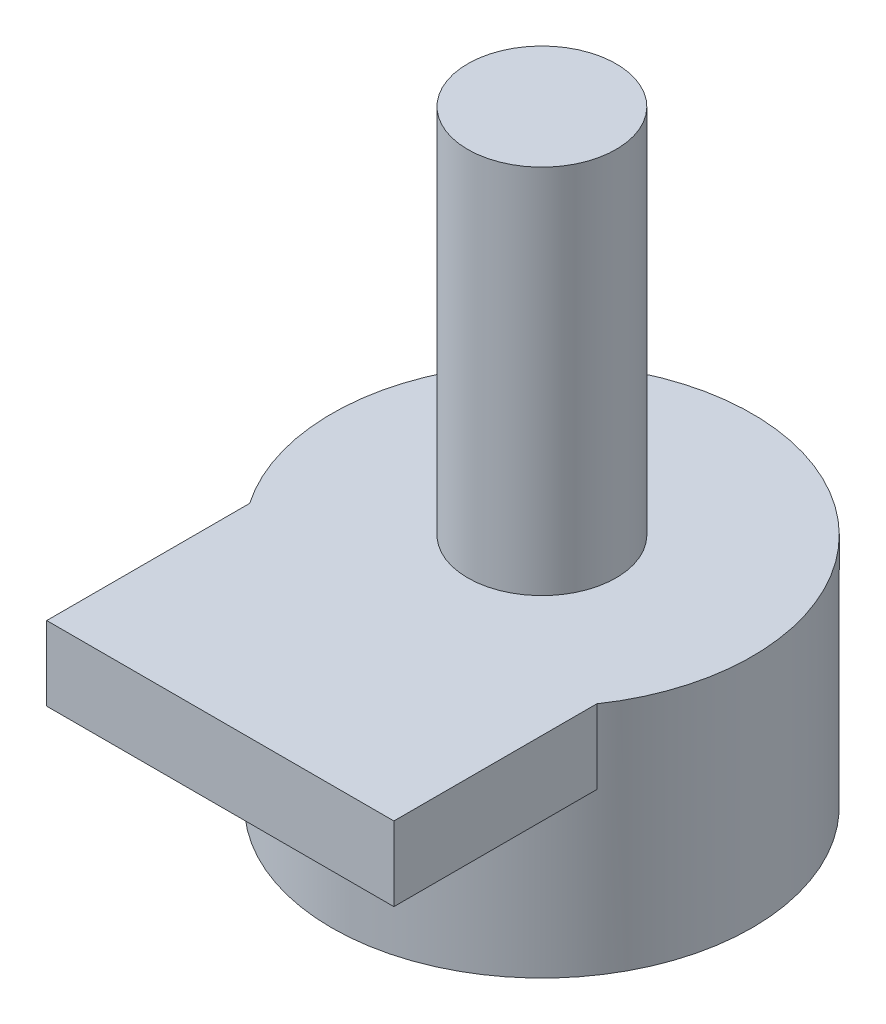
ISO-10303-21;
HEADER;
FILE_DESCRIPTION(('STEP AP214'),'2;1');
FILE_NAME('part.step','',(''),(''),'','','');
FILE_SCHEMA(('AUTOMOTIVE_DESIGN { 1 0 10303 214 1 1 1 1 }'));
ENDSEC;
DATA;
#1=APPLICATION_CONTEXT('core data for automotive mechanical design processes');
#2=APPLICATION_PROTOCOL_DEFINITION('international standard','automotive_design',2000,#1);
#3=PRODUCT_CONTEXT('',#1,'mechanical');
#4=PRODUCT('Part','Part','',(#3));
#5=PRODUCT_RELATED_PRODUCT_CATEGORY('part','',(#4));
#6=PRODUCT_DEFINITION_FORMATION('','',#4);
#7=PRODUCT_DEFINITION_CONTEXT('part definition',#1,'design');
#8=PRODUCT_DEFINITION('design','',#6,#7);
#9=PRODUCT_DEFINITION_SHAPE('','',#8);
#10=(LENGTH_UNIT() NAMED_UNIT(*) SI_UNIT(.MILLI.,.METRE.));
#11=(NAMED_UNIT(*) PLANE_ANGLE_UNIT() SI_UNIT($,.RADIAN.));
#12=(NAMED_UNIT(*) SI_UNIT($,.STERADIAN.) SOLID_ANGLE_UNIT());
#13=UNCERTAINTY_MEASURE_WITH_UNIT(LENGTH_MEASURE(1.E-05),#10,'distance_accuracy_value','');
#14=(GEOMETRIC_REPRESENTATION_CONTEXT(3) GLOBAL_UNCERTAINTY_ASSIGNED_CONTEXT((#13)) GLOBAL_UNIT_ASSIGNED_CONTEXT((#10,
#11,#12)) REPRESENTATION_CONTEXT('',''));
#15=CARTESIAN_POINT('',(0.,0.,0.));
#16=DIRECTION('',(0.,0.,1.));
#17=DIRECTION('',(1.,0.,0.));
#18=AXIS2_PLACEMENT_3D('',#15,#16,#17);
#19=CARTESIAN_POINT('',(-8.41252066336053,6.5,13.));
#20=DIRECTION('',(0.,0.,1.));
#21=DIRECTION('',(1.,0.,0.));
#22=AXIS2_PLACEMENT_3D('',#19,#20,#21);
#23=PLANE('',#22);
#24=DIRECTION('',(1.,0.,0.));
#25=VECTOR('',#24,1.);
#26=CARTESIAN_POINT('',(-8.41252066336053,9.5,13.));
#27=LINE('',#26,#25);
#28=CARTESIAN_POINT('',(-7.01647233942004,9.5,13.));
#29=VERTEX_POINT('',#28);
#30=CARTESIAN_POINT('',(7.01647233942004,9.5,13.));
#31=VERTEX_POINT('',#30);
#32=EDGE_CURVE('E125',#29,#31,#27,.T.);
#33=ORIENTED_EDGE('',*,*,#32,.F.);
#34=DIRECTION('',(0.,-1.,0.));
#35=VECTOR('',#34,1.);
#36=CARTESIAN_POINT('',(-7.01647233942004,24.5,13.));
#37=LINE('',#36,#35);
#38=CARTESIAN_POINT('',(-7.01647233942004,6.5,13.));
#39=VERTEX_POINT('',#38);
#40=EDGE_CURVE('E93',#29,#39,#37,.T.);
#41=ORIENTED_EDGE('',*,*,#40,.T.);
#42=DIRECTION('',(1.,0.,0.));
#43=VECTOR('',#42,1.);
#44=CARTESIAN_POINT('',(-8.41252066336053,6.5,13.));
#45=LINE('',#44,#43);
#46=CARTESIAN_POINT('',(7.01647233942004,6.5,13.));
#47=VERTEX_POINT('',#46);
#48=EDGE_CURVE('E99',#39,#47,#45,.T.);
#49=ORIENTED_EDGE('',*,*,#48,.T.);
#50=DIRECTION('',(0.,-1.,0.));
#51=VECTOR('',#50,1.);
#52=CARTESIAN_POINT('',(7.01647233942004,24.5,13.));
#53=LINE('',#52,#51);
#54=EDGE_CURVE('E132',#31,#47,#53,.T.);
#55=ORIENTED_EDGE('',*,*,#54,.F.);
#56=EDGE_LOOP('',(#33,#41,#49,#55));
#57=FACE_BOUND('',#56,.T.);
#58=ADVANCED_FACE('F44',(#57),#23,.T.);
#59=CARTESIAN_POINT('',(0.,9.5,0.));
#60=DIRECTION('',(0.,-1.,0.));
#61=DIRECTION('',(0.,0.,-1.));
#62=AXIS2_PLACEMENT_3D('',#59,#60,#61);
#63=CYLINDRICAL_SURFACE('',#62,8.5);
#64=CARTESIAN_POINT('',(0.,6.5,0.));
#65=DIRECTION('',(0.,1.,0.));
#66=DIRECTION('',(0.,0.,1.));
#67=AXIS2_PLACEMENT_3D('',#64,#65,#66);
#68=CIRCLE('',#67,8.5);
#69=CARTESIAN_POINT('',(-7.01647233942004,6.5,4.79782408078428));
#70=VERTEX_POINT('',#69);
#71=CARTESIAN_POINT('',(7.01647233942004,6.5,4.79782408078428));
#72=VERTEX_POINT('',#71);
#73=EDGE_CURVE('E98',#70,#72,#68,.T.);
#74=ORIENTED_EDGE('',*,*,#73,.F.);
#75=DIRECTION('',(0.,-1.,0.));
#76=VECTOR('',#75,1.);
#77=CARTESIAN_POINT('',(-7.01647233942004,24.5,4.79782408078428));
#78=LINE('',#77,#76);
#79=CARTESIAN_POINT('',(-7.01647233942004,9.5,4.79782408078428));
#80=VERTEX_POINT('',#79);
#81=EDGE_CURVE('E83',#80,#70,#78,.T.);
#82=ORIENTED_EDGE('',*,*,#81,.F.);
#83=CARTESIAN_POINT('',(0.,9.5,0.));
#84=DIRECTION('',(0.,1.,0.));
#85=DIRECTION('',(0.,0.,1.));
#86=AXIS2_PLACEMENT_3D('',#83,#84,#85);
#87=CIRCLE('',#86,8.5);
#88=CARTESIAN_POINT('',(7.01647233942004,9.5,4.79782408078428));
#89=VERTEX_POINT('',#88);
#90=EDGE_CURVE('E61',#89,#80,#87,.T.);
#91=ORIENTED_EDGE('',*,*,#90,.F.);
#92=DIRECTION('',(0.,-1.,0.));
#93=VECTOR('',#92,1.);
#94=CARTESIAN_POINT('',(7.01647233942004,24.5,4.79782408078428));
#95=LINE('',#94,#93);
#96=EDGE_CURVE('E104',#89,#72,#95,.T.);
#97=ORIENTED_EDGE('',*,*,#96,.T.);
#98=EDGE_LOOP('',(#74,#82,#91,#97));
#99=FACE_BOUND('',#98,.T.);
#100=CARTESIAN_POINT('',(0.,0.,0.));
#101=DIRECTION('',(0.,1.,0.));
#102=DIRECTION('',(0.,0.,1.));
#103=AXIS2_PLACEMENT_3D('',#100,#101,#102);
#104=CIRCLE('',#103,8.5);
#105=CARTESIAN_POINT('',(0.,0.,8.5));
#106=VERTEX_POINT('',#105);
#107=EDGE_CURVE('E113',#106,#106,#104,.T.);
#108=ORIENTED_EDGE('',*,*,#107,.T.);
#109=EDGE_LOOP('',(#108));
#110=FACE_BOUND('',#109,.T.);
#111=ADVANCED_FACE('F50',(#99,#110),#63,.T.);
#112=CARTESIAN_POINT('',(0.,9.5,0.));
#113=DIRECTION('',(0.,1.,0.));
#114=DIRECTION('',(0.,0.,1.));
#115=AXIS2_PLACEMENT_3D('',#112,#113,#114);
#116=PLANE('',#115);
#117=DIRECTION('',(0.,0.,-1.));
#118=VECTOR('',#117,1.);
#119=CARTESIAN_POINT('',(-7.01647233942004,9.5,0.));
#120=LINE('',#119,#118);
#121=EDGE_CURVE('E11',#29,#80,#120,.T.);
#122=ORIENTED_EDGE('',*,*,#121,.F.);
#123=ORIENTED_EDGE('',*,*,#32,.T.);
#124=DIRECTION('',(0.,0.,1.));
#125=VECTOR('',#124,1.);
#126=CARTESIAN_POINT('',(7.01647233942004,9.5,0.));
#127=LINE('',#126,#125);
#128=EDGE_CURVE('E53',#89,#31,#127,.T.);
#129=ORIENTED_EDGE('',*,*,#128,.F.);
#130=ORIENTED_EDGE('',*,*,#90,.T.);
#131=EDGE_LOOP('',(#122,#123,#129,#130));
#132=FACE_BOUND('',#131,.T.);
#133=CARTESIAN_POINT('',(0.,9.5,0.));
#134=DIRECTION('',(0.,1.,0.));
#135=DIRECTION('',(0.,0.,1.));
#136=AXIS2_PLACEMENT_3D('',#133,#134,#135);
#137=CIRCLE('',#136,3.);
#138=CARTESIAN_POINT('',(0.,9.5,3.));
#139=VERTEX_POINT('',#138);
#140=EDGE_CURVE('E107',#139,#139,#137,.T.);
#141=ORIENTED_EDGE('',*,*,#140,.F.);
#142=EDGE_LOOP('',(#141));
#143=FACE_BOUND('',#142,.T.);
#144=ADVANCED_FACE('F142',(#132,#143),#116,.T.);
#145=CARTESIAN_POINT('',(0.,0.,0.));
#146=DIRECTION('',(0.,1.,0.));
#147=DIRECTION('',(0.,0.,1.));
#148=AXIS2_PLACEMENT_3D('',#145,#146,#147);
#149=PLANE('',#148);
#150=ORIENTED_EDGE('',*,*,#107,.F.);
#151=EDGE_LOOP('',(#150));
#152=FACE_BOUND('',#151,.T.);
#153=ADVANCED_FACE('F170',(#152),#149,.F.);
#154=CARTESIAN_POINT('',(0.,24.5,0.));
#155=DIRECTION('',(0.,-1.,0.));
#156=DIRECTION('',(0.,0.,-1.));
#157=AXIS2_PLACEMENT_3D('',#154,#155,#156);
#158=CYLINDRICAL_SURFACE('',#157,3.);
#159=CARTESIAN_POINT('',(0.,24.5,0.));
#160=DIRECTION('',(0.,1.,0.));
#161=DIRECTION('',(0.,0.,1.));
#162=AXIS2_PLACEMENT_3D('',#159,#160,#161);
#163=CIRCLE('',#162,3.);
#164=CARTESIAN_POINT('',(0.,24.5,3.));
#165=VERTEX_POINT('',#164);
#166=EDGE_CURVE('E118',#165,#165,#163,.T.);
#167=ORIENTED_EDGE('',*,*,#166,.F.);
#168=EDGE_LOOP('',(#167));
#169=FACE_BOUND('',#168,.T.);
#170=ORIENTED_EDGE('',*,*,#140,.T.);
#171=EDGE_LOOP('',(#170));
#172=FACE_BOUND('',#171,.T.);
#173=ADVANCED_FACE('F163',(#169,#172),#158,.T.);
#174=CARTESIAN_POINT('',(0.,24.5,0.));
#175=DIRECTION('',(0.,1.,0.));
#176=DIRECTION('',(0.,0.,1.));
#177=AXIS2_PLACEMENT_3D('',#174,#175,#176);
#178=PLANE('',#177);
#179=ORIENTED_EDGE('',*,*,#166,.T.);
#180=EDGE_LOOP('',(#179));
#181=FACE_BOUND('',#180,.T.);
#182=ADVANCED_FACE('F153',(#181),#178,.T.);
#183=CARTESIAN_POINT('',(0.,6.5,0.));
#184=DIRECTION('',(0.,1.,0.));
#185=DIRECTION('',(0.,0.,1.));
#186=AXIS2_PLACEMENT_3D('',#183,#184,#185);
#187=PLANE('',#186);
#188=DIRECTION('',(0.,0.,1.));
#189=VECTOR('',#188,1.);
#190=CARTESIAN_POINT('',(-7.01647233942004,6.5,13.));
#191=LINE('',#190,#189);
#192=EDGE_CURVE('E87',#70,#39,#191,.T.);
#193=ORIENTED_EDGE('',*,*,#192,.F.);
#194=ORIENTED_EDGE('',*,*,#73,.T.);
#195=DIRECTION('',(0.,0.,-1.));
#196=VECTOR('',#195,1.);
#197=CARTESIAN_POINT('',(7.01647233942004,6.5,13.));
#198=LINE('',#197,#196);
#199=EDGE_CURVE('E105',#47,#72,#198,.T.);
#200=ORIENTED_EDGE('',*,*,#199,.F.);
#201=ORIENTED_EDGE('',*,*,#48,.F.);
#202=EDGE_LOOP('',(#193,#194,#200,#201));
#203=FACE_BOUND('',#202,.T.);
#204=ADVANCED_FACE('F96',(#203),#187,.F.);
#205=CARTESIAN_POINT('',(7.01647233942004,24.5,13.));
#206=DIRECTION('',(-1.,0.,0.));
#207=DIRECTION('',(0.,0.,1.));
#208=AXIS2_PLACEMENT_3D('',#205,#206,#207);
#209=PLANE('',#208);
#210=ORIENTED_EDGE('',*,*,#128,.T.);
#211=ORIENTED_EDGE('',*,*,#54,.T.);
#212=ORIENTED_EDGE('',*,*,#199,.T.);
#213=ORIENTED_EDGE('',*,*,#96,.F.);
#214=EDGE_LOOP('',(#210,#211,#212,#213));
#215=FACE_BOUND('',#214,.T.);
#216=ADVANCED_FACE('F144',(#215),#209,.F.);
#217=CARTESIAN_POINT('',(-7.01647233942004,24.5,13.));
#218=DIRECTION('',(1.,0.,0.));
#219=DIRECTION('',(0.,0.,-1.));
#220=AXIS2_PLACEMENT_3D('',#217,#218,#219);
#221=PLANE('',#220);
#222=ORIENTED_EDGE('',*,*,#121,.T.);
#223=ORIENTED_EDGE('',*,*,#81,.T.);
#224=ORIENTED_EDGE('',*,*,#192,.T.);
#225=ORIENTED_EDGE('',*,*,#40,.F.);
#226=EDGE_LOOP('',(#222,#223,#224,#225));
#227=FACE_BOUND('',#226,.T.);
#228=ADVANCED_FACE('F88',(#227),#221,.F.);
#229=CLOSED_SHELL('',(#58,#111,#144,#153,#173,#182,#204,#216,#228));
#230=MANIFOLD_SOLID_BREP('B2',#229);
#231=ADVANCED_BREP_SHAPE_REPRESENTATION('',(#18,#230),#14);
#232=SHAPE_DEFINITION_REPRESENTATION(#9,#231);
ENDSEC;
END-ISO-10303-21;
